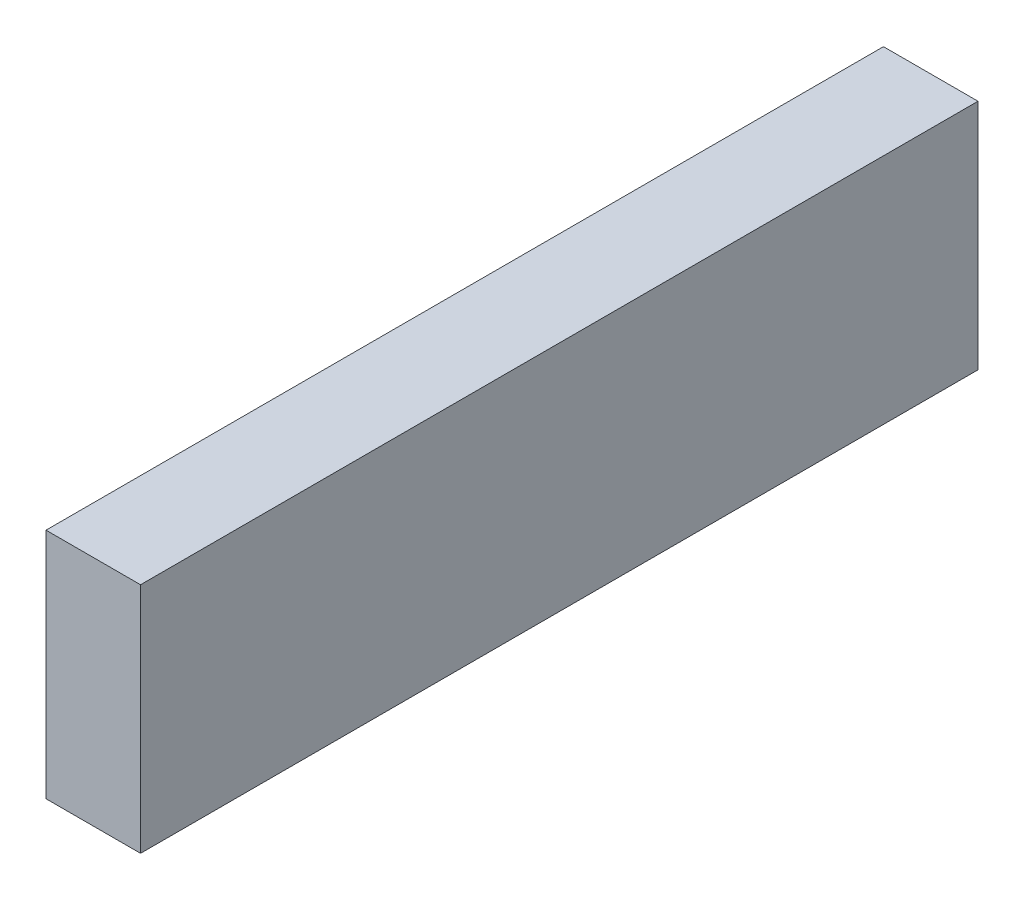
ISO-10303-21;
HEADER;
FILE_DESCRIPTION(('STEP AP214'),'2;1');
FILE_NAME('part.step','',(''),(''),'','','');
FILE_SCHEMA(('AUTOMOTIVE_DESIGN { 1 0 10303 214 1 1 1 1 }'));
ENDSEC;
DATA;
#1=APPLICATION_CONTEXT('core data for automotive mechanical design processes');
#2=APPLICATION_PROTOCOL_DEFINITION('international standard','automotive_design',2000,#1);
#3=PRODUCT_CONTEXT('',#1,'mechanical');
#4=PRODUCT('Part','Part','',(#3));
#5=PRODUCT_RELATED_PRODUCT_CATEGORY('part','',(#4));
#6=PRODUCT_DEFINITION_FORMATION('','',#4);
#7=PRODUCT_DEFINITION_CONTEXT('part definition',#1,'design');
#8=PRODUCT_DEFINITION('design','',#6,#7);
#9=PRODUCT_DEFINITION_SHAPE('','',#8);
#10=(LENGTH_UNIT() NAMED_UNIT(*) SI_UNIT(.MILLI.,.METRE.));
#11=(NAMED_UNIT(*) PLANE_ANGLE_UNIT() SI_UNIT($,.RADIAN.));
#12=(NAMED_UNIT(*) SI_UNIT($,.STERADIAN.) SOLID_ANGLE_UNIT());
#13=UNCERTAINTY_MEASURE_WITH_UNIT(LENGTH_MEASURE(1.E-05),#10,'distance_accuracy_value','');
#14=(GEOMETRIC_REPRESENTATION_CONTEXT(3) GLOBAL_UNCERTAINTY_ASSIGNED_CONTEXT((#13)) GLOBAL_UNIT_ASSIGNED_CONTEXT((#10,
#11,#12)) REPRESENTATION_CONTEXT('',''));
#15=CARTESIAN_POINT('',(0.,0.,0.));
#16=DIRECTION('',(0.,0.,1.));
#17=DIRECTION('',(1.,0.,0.));
#18=AXIS2_PLACEMENT_3D('',#15,#16,#17);
#19=CARTESIAN_POINT('',(0.,0.,900.));
#20=DIRECTION('',(1.,0.,0.));
#21=DIRECTION('',(0.,1.,0.));
#22=AXIS2_PLACEMENT_3D('',#19,#20,#21);
#23=PLANE('',#22);
#24=DIRECTION('',(0.,-1.,0.));
#25=VECTOR('',#24,1.);
#26=CARTESIAN_POINT('',(0.,0.,0.));
#27=LINE('',#26,#25);
#28=CARTESIAN_POINT('',(0.,0.,0.));
#29=VERTEX_POINT('',#28);
#30=CARTESIAN_POINT('',(0.,-250.,0.));
#31=VERTEX_POINT('',#30);
#32=EDGE_CURVE('E98',#29,#31,#27,.T.);
#33=ORIENTED_EDGE('',*,*,#32,.T.);
#34=DIRECTION('',(0.,0.,-1.));
#35=VECTOR('',#34,1.);
#36=CARTESIAN_POINT('',(0.,-250.,900.));
#37=LINE('',#36,#35);
#38=CARTESIAN_POINT('',(0.,-250.,900.));
#39=VERTEX_POINT('',#38);
#40=EDGE_CURVE('E11',#39,#31,#37,.T.);
#41=ORIENTED_EDGE('',*,*,#40,.F.);
#42=DIRECTION('',(0.,-1.,0.));
#43=VECTOR('',#42,1.);
#44=CARTESIAN_POINT('',(0.,0.,900.));
#45=LINE('',#44,#43);
#46=CARTESIAN_POINT('',(0.,0.,900.));
#47=VERTEX_POINT('',#46);
#48=EDGE_CURVE('E86',#47,#39,#45,.T.);
#49=ORIENTED_EDGE('',*,*,#48,.F.);
#50=DIRECTION('',(0.,0.,-1.));
#51=VECTOR('',#50,1.);
#52=CARTESIAN_POINT('',(0.,0.,900.));
#53=LINE('',#52,#51);
#54=EDGE_CURVE('E94',#47,#29,#53,.T.);
#55=ORIENTED_EDGE('',*,*,#54,.T.);
#56=EDGE_LOOP('',(#33,#41,#49,#55));
#57=FACE_BOUND('',#56,.T.);
#58=ADVANCED_FACE('F35',(#57),#23,.F.);
#59=CARTESIAN_POINT('',(0.,-250.,900.));
#60=DIRECTION('',(0.,1.,0.));
#61=DIRECTION('',(0.,0.,1.));
#62=AXIS2_PLACEMENT_3D('',#59,#60,#61);
#63=PLANE('',#62);
#64=DIRECTION('',(1.,0.,0.));
#65=VECTOR('',#64,1.);
#66=CARTESIAN_POINT('',(0.,-250.,0.));
#67=LINE('',#66,#65);
#68=CARTESIAN_POINT('',(101.6,-250.,0.));
#69=VERTEX_POINT('',#68);
#70=EDGE_CURVE('E90',#31,#69,#67,.T.);
#71=ORIENTED_EDGE('',*,*,#70,.T.);
#72=DIRECTION('',(0.,0.,-1.));
#73=VECTOR('',#72,1.);
#74=CARTESIAN_POINT('',(101.6,-250.,900.));
#75=LINE('',#74,#73);
#76=CARTESIAN_POINT('',(101.6,-250.,900.));
#77=VERTEX_POINT('',#76);
#78=EDGE_CURVE('E43',#77,#69,#75,.T.);
#79=ORIENTED_EDGE('',*,*,#78,.F.);
#80=DIRECTION('',(1.,0.,0.));
#81=VECTOR('',#80,1.);
#82=CARTESIAN_POINT('',(0.,-250.,900.));
#83=LINE('',#82,#81);
#84=EDGE_CURVE('E81',#39,#77,#83,.T.);
#85=ORIENTED_EDGE('',*,*,#84,.F.);
#86=ORIENTED_EDGE('',*,*,#40,.T.);
#87=EDGE_LOOP('',(#71,#79,#85,#86));
#88=FACE_BOUND('',#87,.T.);
#89=ADVANCED_FACE('F89',(#88),#63,.F.);
#90=CARTESIAN_POINT('',(101.6,0.,900.));
#91=DIRECTION('',(-1.,0.,0.));
#92=DIRECTION('',(0.,-1.,0.));
#93=AXIS2_PLACEMENT_3D('',#90,#91,#92);
#94=PLANE('',#93);
#95=DIRECTION('',(0.,1.,0.));
#96=VECTOR('',#95,1.);
#97=CARTESIAN_POINT('',(101.6,0.,0.));
#98=LINE('',#97,#96);
#99=CARTESIAN_POINT('',(101.6,0.,0.));
#100=VERTEX_POINT('',#99);
#101=EDGE_CURVE('E68',#69,#100,#98,.T.);
#102=ORIENTED_EDGE('',*,*,#101,.T.);
#103=DIRECTION('',(0.,0.,-1.));
#104=VECTOR('',#103,1.);
#105=CARTESIAN_POINT('',(101.6,0.,900.));
#106=LINE('',#105,#104);
#107=CARTESIAN_POINT('',(101.6,0.,900.));
#108=VERTEX_POINT('',#107);
#109=EDGE_CURVE('E91',#108,#100,#106,.T.);
#110=ORIENTED_EDGE('',*,*,#109,.F.);
#111=DIRECTION('',(0.,1.,0.));
#112=VECTOR('',#111,1.);
#113=CARTESIAN_POINT('',(101.6,0.,900.));
#114=LINE('',#113,#112);
#115=EDGE_CURVE('E84',#77,#108,#114,.T.);
#116=ORIENTED_EDGE('',*,*,#115,.F.);
#117=ORIENTED_EDGE('',*,*,#78,.T.);
#118=EDGE_LOOP('',(#102,#110,#116,#117));
#119=FACE_BOUND('',#118,.T.);
#120=ADVANCED_FACE('F92',(#119),#94,.F.);
#121=CARTESIAN_POINT('',(0.,0.,900.));
#122=DIRECTION('',(0.,-1.,0.));
#123=DIRECTION('',(0.,0.,-1.));
#124=AXIS2_PLACEMENT_3D('',#121,#122,#123);
#125=PLANE('',#124);
#126=DIRECTION('',(-1.,0.,0.));
#127=VECTOR('',#126,1.);
#128=CARTESIAN_POINT('',(0.,0.,0.));
#129=LINE('',#128,#127);
#130=EDGE_CURVE('E74',#100,#29,#129,.T.);
#131=ORIENTED_EDGE('',*,*,#130,.T.);
#132=ORIENTED_EDGE('',*,*,#54,.F.);
#133=DIRECTION('',(-1.,0.,0.));
#134=VECTOR('',#133,1.);
#135=CARTESIAN_POINT('',(0.,0.,900.));
#136=LINE('',#135,#134);
#137=EDGE_CURVE('E51',#108,#47,#136,.T.);
#138=ORIENTED_EDGE('',*,*,#137,.F.);
#139=ORIENTED_EDGE('',*,*,#109,.T.);
#140=EDGE_LOOP('',(#131,#132,#138,#139));
#141=FACE_BOUND('',#140,.T.);
#142=ADVANCED_FACE('F105',(#141),#125,.F.);
#143=CARTESIAN_POINT('',(0.,0.,900.));
#144=DIRECTION('',(0.,0.,1.));
#145=DIRECTION('',(1.,0.,0.));
#146=AXIS2_PLACEMENT_3D('',#143,#144,#145);
#147=PLANE('',#146);
#148=ORIENTED_EDGE('',*,*,#48,.T.);
#149=ORIENTED_EDGE('',*,*,#84,.T.);
#150=ORIENTED_EDGE('',*,*,#115,.T.);
#151=ORIENTED_EDGE('',*,*,#137,.T.);
#152=EDGE_LOOP('',(#148,#149,#150,#151));
#153=FACE_BOUND('',#152,.T.);
#154=ADVANCED_FACE('F82',(#153),#147,.T.);
#155=CARTESIAN_POINT('',(0.,0.,0.));
#156=DIRECTION('',(0.,0.,1.));
#157=DIRECTION('',(1.,0.,0.));
#158=AXIS2_PLACEMENT_3D('',#155,#156,#157);
#159=PLANE('',#158);
#160=ORIENTED_EDGE('',*,*,#32,.F.);
#161=ORIENTED_EDGE('',*,*,#130,.F.);
#162=ORIENTED_EDGE('',*,*,#101,.F.);
#163=ORIENTED_EDGE('',*,*,#70,.F.);
#164=EDGE_LOOP('',(#160,#161,#162,#163));
#165=FACE_BOUND('',#164,.T.);
#166=ADVANCED_FACE('F108',(#165),#159,.F.);
#167=CLOSED_SHELL('',(#58,#89,#120,#142,#154,#166));
#168=MANIFOLD_SOLID_BREP('B2',#167);
#169=ADVANCED_BREP_SHAPE_REPRESENTATION('',(#18,#168),#14);
#170=SHAPE_DEFINITION_REPRESENTATION(#9,#169);
ENDSEC;
END-ISO-10303-21;
